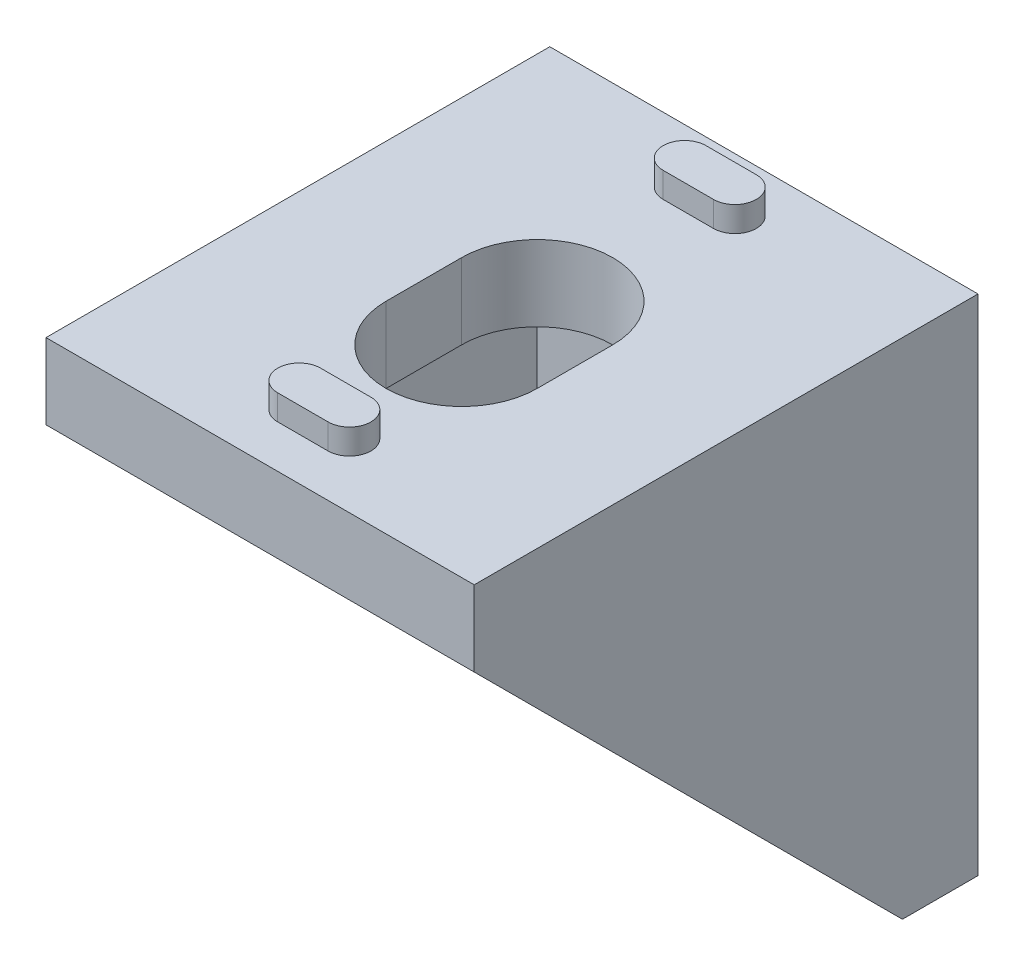
ISO-10303-21;
HEADER;
FILE_DESCRIPTION(('STEP AP214'),'2;1');
FILE_NAME('part.step','',(''),(''),'','','');
FILE_SCHEMA(('AUTOMOTIVE_DESIGN { 1 0 10303 214 1 1 1 1 }'));
ENDSEC;
DATA;
#1=APPLICATION_CONTEXT('core data for automotive mechanical design processes');
#2=APPLICATION_PROTOCOL_DEFINITION('international standard','automotive_design',2000,#1);
#3=PRODUCT_CONTEXT('',#1,'mechanical');
#4=PRODUCT('Part','Part','',(#3));
#5=PRODUCT_RELATED_PRODUCT_CATEGORY('part','',(#4));
#6=PRODUCT_DEFINITION_FORMATION('','',#4);
#7=PRODUCT_DEFINITION_CONTEXT('part definition',#1,'design');
#8=PRODUCT_DEFINITION('design','',#6,#7);
#9=PRODUCT_DEFINITION_SHAPE('','',#8);
#10=(LENGTH_UNIT() NAMED_UNIT(*) SI_UNIT(.MILLI.,.METRE.));
#11=(NAMED_UNIT(*) PLANE_ANGLE_UNIT() SI_UNIT($,.RADIAN.));
#12=(NAMED_UNIT(*) SI_UNIT($,.STERADIAN.) SOLID_ANGLE_UNIT());
#13=UNCERTAINTY_MEASURE_WITH_UNIT(LENGTH_MEASURE(1.E-05),#10,'distance_accuracy_value','');
#14=(GEOMETRIC_REPRESENTATION_CONTEXT(3) GLOBAL_UNCERTAINTY_ASSIGNED_CONTEXT((#13)) GLOBAL_UNIT_ASSIGNED_CONTEXT((#10,
#11,#12)) REPRESENTATION_CONTEXT('',''));
#15=CARTESIAN_POINT('',(0.,0.,0.));
#16=DIRECTION('',(0.,0.,1.));
#17=DIRECTION('',(1.,0.,0.));
#18=AXIS2_PLACEMENT_3D('',#15,#16,#17);
#19=CARTESIAN_POINT('',(8.5,0.,0.));
#20=DIRECTION('',(0.,-1.,0.));
#21=DIRECTION('',(0.,0.,-1.));
#22=AXIS2_PLACEMENT_3D('',#19,#20,#21);
#23=PLANE('',#22);
#24=DIRECTION('',(1.,0.,0.));
#25=VECTOR('',#24,1.);
#26=CARTESIAN_POINT('',(0.999999999999997,0.,16.6));
#27=LINE('',#26,#25);
#28=CARTESIAN_POINT('',(-1.,0.,16.6));
#29=VERTEX_POINT('',#28);
#30=CARTESIAN_POINT('',(0.999999999999997,0.,16.6));
#31=VERTEX_POINT('',#30);
#32=EDGE_CURVE('E273',#29,#31,#27,.T.);
#33=ORIENTED_EDGE('',*,*,#32,.T.);
#34=CARTESIAN_POINT('',(0.999999999999995,0.,17.45));
#35=DIRECTION('',(0.,-1.,0.));
#36=DIRECTION('',(0.,0.,-1.));
#37=AXIS2_PLACEMENT_3D('',#34,#35,#36);
#38=CIRCLE('',#37,0.85);
#39=CARTESIAN_POINT('',(0.999999999999997,0.,18.3));
#40=VERTEX_POINT('',#39);
#41=EDGE_CURVE('E247',#31,#40,#38,.T.);
#42=ORIENTED_EDGE('',*,*,#41,.T.);
#43=DIRECTION('',(-1.,0.,0.));
#44=VECTOR('',#43,1.);
#45=CARTESIAN_POINT('',(0.999999999999997,0.,18.3));
#46=LINE('',#45,#44);
#47=CARTESIAN_POINT('',(-0.999999999999999,0.,18.3));
#48=VERTEX_POINT('',#47);
#49=EDGE_CURVE('E263',#40,#48,#46,.T.);
#50=ORIENTED_EDGE('',*,*,#49,.T.);
#51=CARTESIAN_POINT('',(-1.,0.,17.45));
#52=DIRECTION('',(0.,-1.,0.));
#53=DIRECTION('',(0.,0.,1.));
#54=AXIS2_PLACEMENT_3D('',#51,#52,#53);
#55=CIRCLE('',#54,0.85);
#56=EDGE_CURVE('E47',#48,#29,#55,.T.);
#57=ORIENTED_EDGE('',*,*,#56,.T.);
#58=EDGE_LOOP('',(#33,#42,#50,#57));
#59=FACE_BOUND('',#58,.T.);
#60=DIRECTION('',(1.,0.,0.));
#61=VECTOR('',#60,1.);
#62=CARTESIAN_POINT('',(1.,0.,1.3));
#63=LINE('',#62,#61);
#64=CARTESIAN_POINT('',(-1.,0.,1.3));
#65=VERTEX_POINT('',#64);
#66=CARTESIAN_POINT('',(1.,0.,1.3));
#67=VERTEX_POINT('',#66);
#68=EDGE_CURVE('E298',#65,#67,#63,.T.);
#69=ORIENTED_EDGE('',*,*,#68,.T.);
#70=CARTESIAN_POINT('',(1.,0.,2.15));
#71=DIRECTION('',(0.,-1.,0.));
#72=DIRECTION('',(0.,0.,1.));
#73=AXIS2_PLACEMENT_3D('',#70,#71,#72);
#74=CIRCLE('',#73,0.85);
#75=CARTESIAN_POINT('',(1.,0.,3.));
#76=VERTEX_POINT('',#75);
#77=EDGE_CURVE('E252',#67,#76,#74,.T.);
#78=ORIENTED_EDGE('',*,*,#77,.T.);
#79=DIRECTION('',(-1.,0.,0.));
#80=VECTOR('',#79,1.);
#81=CARTESIAN_POINT('',(1.,0.,3.));
#82=LINE('',#81,#80);
#83=CARTESIAN_POINT('',(-0.999999999999999,0.,3.));
#84=VERTEX_POINT('',#83);
#85=EDGE_CURVE('E286',#76,#84,#82,.T.);
#86=ORIENTED_EDGE('',*,*,#85,.T.);
#87=CARTESIAN_POINT('',(-1.,0.,2.15));
#88=DIRECTION('',(0.,-1.,0.));
#89=DIRECTION('',(0.,0.,-1.));
#90=AXIS2_PLACEMENT_3D('',#87,#88,#89);
#91=CIRCLE('',#90,0.85);
#92=EDGE_CURVE('E55',#84,#65,#91,.T.);
#93=ORIENTED_EDGE('',*,*,#92,.T.);
#94=EDGE_LOOP('',(#69,#78,#86,#93));
#95=FACE_BOUND('',#94,.T.);
#96=DIRECTION('',(0.,0.,1.));
#97=VECTOR('',#96,1.);
#98=CARTESIAN_POINT('',(-8.5,0.,0.));
#99=LINE('',#98,#97);
#100=CARTESIAN_POINT('',(-8.5,0.,0.));
#101=VERTEX_POINT('',#100);
#102=CARTESIAN_POINT('',(-8.5,0.,20.));
#103=VERTEX_POINT('',#102);
#104=EDGE_CURVE('E476',#101,#103,#99,.T.);
#105=ORIENTED_EDGE('',*,*,#104,.T.);
#106=DIRECTION('',(-1.,0.,0.));
#107=VECTOR('',#106,1.);
#108=CARTESIAN_POINT('',(8.5,0.,20.));
#109=LINE('',#108,#107);
#110=CARTESIAN_POINT('',(8.5,0.,20.));
#111=VERTEX_POINT('',#110);
#112=EDGE_CURVE('E495',#111,#103,#109,.T.);
#113=ORIENTED_EDGE('',*,*,#112,.F.);
#114=DIRECTION('',(0.,0.,1.));
#115=VECTOR('',#114,1.);
#116=CARTESIAN_POINT('',(8.5,0.,0.));
#117=LINE('',#116,#115);
#118=CARTESIAN_POINT('',(8.5,0.,0.));
#119=VERTEX_POINT('',#118);
#120=EDGE_CURVE('E464',#119,#111,#117,.T.);
#121=ORIENTED_EDGE('',*,*,#120,.F.);
#122=DIRECTION('',(-1.,0.,0.));
#123=VECTOR('',#122,1.);
#124=CARTESIAN_POINT('',(8.5,0.,0.));
#125=LINE('',#124,#123);
#126=EDGE_CURVE('E498',#119,#101,#125,.T.);
#127=ORIENTED_EDGE('',*,*,#126,.T.);
#128=EDGE_LOOP('',(#105,#113,#121,#127));
#129=FACE_BOUND('',#128,.T.);
#130=CARTESIAN_POINT('',(0.,0.,9.00000000000001));
#131=DIRECTION('',(0.,-1.,0.));
#132=DIRECTION('',(0.,0.,-1.));
#133=AXIS2_PLACEMENT_3D('',#130,#131,#132);
#134=CIRCLE('',#133,3.);
#135=CARTESIAN_POINT('',(-3.,0.,9.));
#136=VERTEX_POINT('',#135);
#137=CARTESIAN_POINT('',(3.,0.,9.));
#138=VERTEX_POINT('',#137);
#139=EDGE_CURVE('E317',#136,#138,#134,.T.);
#140=ORIENTED_EDGE('',*,*,#139,.T.);
#141=DIRECTION('',(0.,0.,1.));
#142=VECTOR('',#141,1.);
#143=CARTESIAN_POINT('',(3.,0.,9.00000000000001));
#144=LINE('',#143,#142);
#145=CARTESIAN_POINT('',(3.,0.,12.));
#146=VERTEX_POINT('',#145);
#147=EDGE_CURVE('E335',#138,#146,#144,.T.);
#148=ORIENTED_EDGE('',*,*,#147,.T.);
#149=CARTESIAN_POINT('',(0.,0.,12.));
#150=DIRECTION('',(0.,-1.,0.));
#151=DIRECTION('',(0.,0.,-1.));
#152=AXIS2_PLACEMENT_3D('',#149,#150,#151);
#153=CIRCLE('',#152,3.);
#154=CARTESIAN_POINT('',(-3.,0.,12.));
#155=VERTEX_POINT('',#154);
#156=EDGE_CURVE('E311',#146,#155,#153,.T.);
#157=ORIENTED_EDGE('',*,*,#156,.T.);
#158=DIRECTION('',(0.,0.,-1.));
#159=VECTOR('',#158,1.);
#160=CARTESIAN_POINT('',(-3.,0.,9.00000000000001));
#161=LINE('',#160,#159);
#162=EDGE_CURVE('E314',#155,#136,#161,.T.);
#163=ORIENTED_EDGE('',*,*,#162,.T.);
#164=EDGE_LOOP('',(#140,#148,#157,#163));
#165=FACE_BOUND('',#164,.T.);
#166=ADVANCED_FACE('F32',(#59,#95,#129,#165),#23,.F.);
#167=CARTESIAN_POINT('',(-6.,-3.,2.99999999999999));
#168=DIRECTION('',(0.,1.,0.));
#169=DIRECTION('',(0.,0.,1.));
#170=AXIS2_PLACEMENT_3D('',#167,#168,#169);
#171=PLANE('',#170);
#172=DIRECTION('',(0.,0.,1.));
#173=VECTOR('',#172,1.);
#174=CARTESIAN_POINT('',(6.,-3.,2.99999999999999));
#175=LINE('',#174,#173);
#176=CARTESIAN_POINT('',(6.,-3.,2.99999999999999));
#177=VERTEX_POINT('',#176);
#178=CARTESIAN_POINT('',(6.,-3.,20.));
#179=VERTEX_POINT('',#178);
#180=EDGE_CURVE('E446',#177,#179,#175,.T.);
#181=ORIENTED_EDGE('',*,*,#180,.T.);
#182=DIRECTION('',(1.,0.,0.));
#183=VECTOR('',#182,1.);
#184=CARTESIAN_POINT('',(-6.,-3.,20.));
#185=LINE('',#184,#183);
#186=CARTESIAN_POINT('',(-6.,-3.,20.));
#187=VERTEX_POINT('',#186);
#188=EDGE_CURVE('E457',#187,#179,#185,.T.);
#189=ORIENTED_EDGE('',*,*,#188,.F.);
#190=DIRECTION('',(0.,0.,1.));
#191=VECTOR('',#190,1.);
#192=CARTESIAN_POINT('',(-6.,-3.,2.99999999999999));
#193=LINE('',#192,#191);
#194=CARTESIAN_POINT('',(-6.,-3.,2.99999999999999));
#195=VERTEX_POINT('',#194);
#196=EDGE_CURVE('E445',#195,#187,#193,.T.);
#197=ORIENTED_EDGE('',*,*,#196,.F.);
#198=DIRECTION('',(1.,0.,0.));
#199=VECTOR('',#198,1.);
#200=CARTESIAN_POINT('',(-6.,-3.,2.99999999999999));
#201=LINE('',#200,#199);
#202=EDGE_CURVE('E449',#195,#177,#201,.T.);
#203=ORIENTED_EDGE('',*,*,#202,.T.);
#204=EDGE_LOOP('',(#181,#189,#197,#203));
#205=FACE_BOUND('',#204,.T.);
#206=CARTESIAN_POINT('',(0.,-3.,9.));
#207=DIRECTION('',(0.,1.,0.));
#208=DIRECTION('',(-1.,0.,0.));
#209=AXIS2_PLACEMENT_3D('',#206,#207,#208);
#210=CIRCLE('',#209,3.);
#211=CARTESIAN_POINT('',(3.,-3.,9.));
#212=VERTEX_POINT('',#211);
#213=CARTESIAN_POINT('',(-3.,-3.,9.));
#214=VERTEX_POINT('',#213);
#215=EDGE_CURVE('E320',#212,#214,#210,.T.);
#216=ORIENTED_EDGE('',*,*,#215,.T.);
#217=DIRECTION('',(0.,0.,1.));
#218=VECTOR('',#217,1.);
#219=CARTESIAN_POINT('',(-3.,-3.,9.));
#220=LINE('',#219,#218);
#221=CARTESIAN_POINT('',(-3.,-3.,12.));
#222=VERTEX_POINT('',#221);
#223=EDGE_CURVE('E329',#214,#222,#220,.T.);
#224=ORIENTED_EDGE('',*,*,#223,.T.);
#225=CARTESIAN_POINT('',(0.,-3.,12.));
#226=DIRECTION('',(0.,1.,0.));
#227=DIRECTION('',(1.,0.,0.));
#228=AXIS2_PLACEMENT_3D('',#225,#226,#227);
#229=CIRCLE('',#228,3.);
#230=CARTESIAN_POINT('',(3.,-3.,12.));
#231=VERTEX_POINT('',#230);
#232=EDGE_CURVE('E326',#222,#231,#229,.T.);
#233=ORIENTED_EDGE('',*,*,#232,.T.);
#234=DIRECTION('',(0.,0.,-1.));
#235=VECTOR('',#234,1.);
#236=CARTESIAN_POINT('',(3.,-3.,9.));
#237=LINE('',#236,#235);
#238=EDGE_CURVE('E323',#231,#212,#237,.T.);
#239=ORIENTED_EDGE('',*,*,#238,.T.);
#240=EDGE_LOOP('',(#216,#224,#233,#239));
#241=FACE_BOUND('',#240,.T.);
#242=ADVANCED_FACE('F508',(#205,#241),#171,.F.);
#243=CARTESIAN_POINT('',(8.5,0.,0.));
#244=DIRECTION('',(0.,0.,1.));
#245=DIRECTION('',(0.,-1.,0.));
#246=AXIS2_PLACEMENT_3D('',#243,#244,#245);
#247=PLANE('',#246);
#248=CARTESIAN_POINT('',(1.,-2.15,0.));
#249=DIRECTION('',(0.,0.,-1.));
#250=DIRECTION('',(0.,-1.,0.));
#251=AXIS2_PLACEMENT_3D('',#248,#249,#250);
#252=CIRCLE('',#251,0.85);
#253=CARTESIAN_POINT('',(1.,-1.3,0.));
#254=VERTEX_POINT('',#253);
#255=CARTESIAN_POINT('',(1.,-3.,0.));
#256=VERTEX_POINT('',#255);
#257=EDGE_CURVE('E377',#254,#256,#252,.T.);
#258=ORIENTED_EDGE('',*,*,#257,.F.);
#259=DIRECTION('',(1.,0.,0.));
#260=VECTOR('',#259,1.);
#261=CARTESIAN_POINT('',(1.,-1.3,0.));
#262=LINE('',#261,#260);
#263=CARTESIAN_POINT('',(-0.999999999999999,-1.3,0.));
#264=VERTEX_POINT('',#263);
#265=EDGE_CURVE('E382',#264,#254,#262,.T.);
#266=ORIENTED_EDGE('',*,*,#265,.F.);
#267=CARTESIAN_POINT('',(-1.,-2.15,0.));
#268=DIRECTION('',(0.,0.,-1.));
#269=DIRECTION('',(0.,1.,0.));
#270=AXIS2_PLACEMENT_3D('',#267,#268,#269);
#271=CIRCLE('',#270,0.85);
#272=CARTESIAN_POINT('',(-1.,-3.,0.));
#273=VERTEX_POINT('',#272);
#274=EDGE_CURVE('E394',#273,#264,#271,.T.);
#275=ORIENTED_EDGE('',*,*,#274,.F.);
#276=DIRECTION('',(-1.,0.,0.));
#277=VECTOR('',#276,1.);
#278=CARTESIAN_POINT('',(1.,-3.,0.));
#279=LINE('',#278,#277);
#280=EDGE_CURVE('E391',#256,#273,#279,.T.);
#281=ORIENTED_EDGE('',*,*,#280,.F.);
#282=EDGE_LOOP('',(#258,#266,#275,#281));
#283=FACE_BOUND('',#282,.T.);
#284=DIRECTION('',(0.,-1.,0.));
#285=VECTOR('',#284,1.);
#286=CARTESIAN_POINT('',(3.,-9.00000000000001,0.));
#287=LINE('',#286,#285);
#288=CARTESIAN_POINT('',(3.,-9.00000000000001,0.));
#289=VERTEX_POINT('',#288);
#290=CARTESIAN_POINT('',(3.,-12.,0.));
#291=VERTEX_POINT('',#290);
#292=EDGE_CURVE('E412',#289,#291,#287,.T.);
#293=ORIENTED_EDGE('',*,*,#292,.F.);
#294=CARTESIAN_POINT('',(0.,-9.00000000000001,0.));
#295=DIRECTION('',(0.,0.,1.));
#296=DIRECTION('',(0.,-1.,0.));
#297=AXIS2_PLACEMENT_3D('',#294,#295,#296);
#298=CIRCLE('',#297,3.);
#299=CARTESIAN_POINT('',(-3.,-9.00000000000001,0.));
#300=VERTEX_POINT('',#299);
#301=EDGE_CURVE('E415',#300,#289,#298,.F.);
#302=ORIENTED_EDGE('',*,*,#301,.F.);
#303=DIRECTION('',(0.,1.,0.));
#304=VECTOR('',#303,1.);
#305=CARTESIAN_POINT('',(-3.,-9.00000000000001,0.));
#306=LINE('',#305,#304);
#307=CARTESIAN_POINT('',(-3.,-12.,0.));
#308=VERTEX_POINT('',#307);
#309=EDGE_CURVE('E432',#308,#300,#306,.T.);
#310=ORIENTED_EDGE('',*,*,#309,.F.);
#311=CARTESIAN_POINT('',(0.,-12.,0.));
#312=DIRECTION('',(0.,0.,1.));
#313=DIRECTION('',(0.,-1.,0.));
#314=AXIS2_PLACEMENT_3D('',#311,#312,#313);
#315=CIRCLE('',#314,3.);
#316=EDGE_CURVE('E410',#291,#308,#315,.F.);
#317=ORIENTED_EDGE('',*,*,#316,.F.);
#318=EDGE_LOOP('',(#293,#302,#310,#317));
#319=FACE_BOUND('',#318,.T.);
#320=DIRECTION('',(0.,1.,0.));
#321=VECTOR('',#320,1.);
#322=CARTESIAN_POINT('',(-8.5,0.,0.));
#323=LINE('',#322,#321);
#324=CARTESIAN_POINT('',(-8.5,-20.,0.));
#325=VERTEX_POINT('',#324);
#326=EDGE_CURVE('E456',#325,#101,#323,.T.);
#327=ORIENTED_EDGE('',*,*,#326,.T.);
#328=ORIENTED_EDGE('',*,*,#126,.F.);
#329=DIRECTION('',(0.,1.,0.));
#330=VECTOR('',#329,1.);
#331=CARTESIAN_POINT('',(8.5,0.,0.));
#332=LINE('',#331,#330);
#333=CARTESIAN_POINT('',(8.5,-20.,0.));
#334=VERTEX_POINT('',#333);
#335=EDGE_CURVE('E461',#334,#119,#332,.T.);
#336=ORIENTED_EDGE('',*,*,#335,.F.);
#337=DIRECTION('',(-1.,0.,0.));
#338=VECTOR('',#337,1.);
#339=CARTESIAN_POINT('',(8.5,-20.,0.));
#340=LINE('',#339,#338);
#341=EDGE_CURVE('E473',#334,#325,#340,.T.);
#342=ORIENTED_EDGE('',*,*,#341,.T.);
#343=EDGE_LOOP('',(#327,#328,#336,#342));
#344=FACE_BOUND('',#343,.T.);
#345=CARTESIAN_POINT('',(0.999999999999995,-17.45,0.));
#346=DIRECTION('',(0.,0.,-1.));
#347=DIRECTION('',(0.,1.,0.));
#348=AXIS2_PLACEMENT_3D('',#345,#346,#347);
#349=CIRCLE('',#348,0.85);
#350=CARTESIAN_POINT('',(0.999999999999997,-16.6,0.));
#351=VERTEX_POINT('',#350);
#352=CARTESIAN_POINT('',(0.999999999999997,-18.3,0.));
#353=VERTEX_POINT('',#352);
#354=EDGE_CURVE('E344',#351,#353,#349,.T.);
#355=ORIENTED_EDGE('',*,*,#354,.F.);
#356=DIRECTION('',(1.,0.,0.));
#357=VECTOR('',#356,1.);
#358=CARTESIAN_POINT('',(0.999999999999997,-16.6,0.));
#359=LINE('',#358,#357);
#360=CARTESIAN_POINT('',(-1.,-16.6,0.));
#361=VERTEX_POINT('',#360);
#362=EDGE_CURVE('E349',#361,#351,#359,.T.);
#363=ORIENTED_EDGE('',*,*,#362,.F.);
#364=CARTESIAN_POINT('',(-1.,-17.45,0.));
#365=DIRECTION('',(0.,0.,-1.));
#366=DIRECTION('',(0.,-1.,0.));
#367=AXIS2_PLACEMENT_3D('',#364,#365,#366);
#368=CIRCLE('',#367,0.85);
#369=CARTESIAN_POINT('',(-1.,-18.3,0.));
#370=VERTEX_POINT('',#369);
#371=EDGE_CURVE('E361',#370,#361,#368,.T.);
#372=ORIENTED_EDGE('',*,*,#371,.F.);
#373=DIRECTION('',(-1.,0.,0.));
#374=VECTOR('',#373,1.);
#375=CARTESIAN_POINT('',(0.999999999999997,-18.3,0.));
#376=LINE('',#375,#374);
#377=EDGE_CURVE('E358',#353,#370,#376,.T.);
#378=ORIENTED_EDGE('',*,*,#377,.F.);
#379=EDGE_LOOP('',(#355,#363,#372,#378));
#380=FACE_BOUND('',#379,.T.);
#381=ADVANCED_FACE('F34',(#283,#319,#344,#380),#247,.F.);
#382=CARTESIAN_POINT('',(8.5,-20.,2.99999999999999));
#383=DIRECTION('',(0.,0.707106781186548,-0.707106781186547));
#384=DIRECTION('',(0.,0.707106781186547,0.707106781186548));
#385=AXIS2_PLACEMENT_3D('',#382,#383,#384);
#386=PLANE('',#385);
#387=DIRECTION('',(0.,0.707106781186547,0.707106781186548));
#388=VECTOR('',#387,1.);
#389=CARTESIAN_POINT('',(6.,-20.,2.99999999999999));
#390=LINE('',#389,#388);
#391=CARTESIAN_POINT('',(6.,-20.,2.99999999999999));
#392=VERTEX_POINT('',#391);
#393=EDGE_CURVE('E40',#392,#179,#390,.T.);
#394=ORIENTED_EDGE('',*,*,#393,.F.);
#395=DIRECTION('',(-1.,0.,0.));
#396=VECTOR('',#395,1.);
#397=CARTESIAN_POINT('',(8.5,-20.,2.99999999999999));
#398=LINE('',#397,#396);
#399=CARTESIAN_POINT('',(8.5,-20.,2.99999999999999));
#400=VERTEX_POINT('',#399);
#401=EDGE_CURVE('E488',#400,#392,#398,.T.);
#402=ORIENTED_EDGE('',*,*,#401,.F.);
#403=DIRECTION('',(0.,-0.707106781186548,-0.707106781186548));
#404=VECTOR('',#403,1.);
#405=CARTESIAN_POINT('',(8.5,-3.,20.));
#406=LINE('',#405,#404);
#407=CARTESIAN_POINT('',(8.5,-3.,20.));
#408=VERTEX_POINT('',#407);
#409=EDGE_CURVE('E469',#408,#400,#406,.T.);
#410=ORIENTED_EDGE('',*,*,#409,.F.);
#411=DIRECTION('',(-1.,0.,0.));
#412=VECTOR('',#411,1.);
#413=CARTESIAN_POINT('',(8.5,-3.,20.));
#414=LINE('',#413,#412);
#415=EDGE_CURVE('E492',#408,#179,#414,.T.);
#416=ORIENTED_EDGE('',*,*,#415,.T.);
#417=EDGE_LOOP('',(#394,#402,#410,#416));
#418=FACE_BOUND('',#417,.T.);
#419=ADVANCED_FACE('F517',(#418),#386,.F.);
#420=CARTESIAN_POINT('',(8.5,0.,20.));
#421=DIRECTION('',(0.,0.,-1.));
#422=DIRECTION('',(-1.,0.,0.));
#423=AXIS2_PLACEMENT_3D('',#420,#421,#422);
#424=PLANE('',#423);
#425=DIRECTION('',(0.,-1.,0.));
#426=VECTOR('',#425,1.);
#427=CARTESIAN_POINT('',(-8.5,0.,20.));
#428=LINE('',#427,#426);
#429=CARTESIAN_POINT('',(-8.5,-3.,20.));
#430=VERTEX_POINT('',#429);
#431=EDGE_CURVE('E478',#103,#430,#428,.T.);
#432=ORIENTED_EDGE('',*,*,#431,.T.);
#433=EDGE_CURVE('E491',#187,#430,#414,.T.);
#434=ORIENTED_EDGE('',*,*,#433,.F.);
#435=ORIENTED_EDGE('',*,*,#188,.T.);
#436=ORIENTED_EDGE('',*,*,#415,.F.);
#437=DIRECTION('',(0.,-1.,0.));
#438=VECTOR('',#437,1.);
#439=CARTESIAN_POINT('',(8.5,0.,20.));
#440=LINE('',#439,#438);
#441=EDGE_CURVE('E467',#111,#408,#440,.T.);
#442=ORIENTED_EDGE('',*,*,#441,.F.);
#443=ORIENTED_EDGE('',*,*,#112,.T.);
#444=EDGE_LOOP('',(#432,#434,#435,#436,#442,#443));
#445=FACE_BOUND('',#444,.T.);
#446=ADVANCED_FACE('F514',(#445),#424,.F.);
#447=CARTESIAN_POINT('',(-6.,-20.,2.99999999999999));
#448=VERTEX_POINT('',#447);
#449=CARTESIAN_POINT('',(-8.5,-20.,2.99999999999999));
#450=VERTEX_POINT('',#449);
#451=EDGE_CURVE('E487',#448,#450,#398,.T.);
#452=ORIENTED_EDGE('',*,*,#451,.F.);
#453=DIRECTION('',(0.,0.707106781186547,0.707106781186548));
#454=VECTOR('',#453,1.);
#455=CARTESIAN_POINT('',(-6.,-20.,2.99999999999999));
#456=LINE('',#455,#454);
#457=EDGE_CURVE('E11',#448,#187,#456,.T.);
#458=ORIENTED_EDGE('',*,*,#457,.T.);
#459=ORIENTED_EDGE('',*,*,#433,.T.);
#460=DIRECTION('',(0.,-0.707106781186547,-0.707106781186548));
#461=VECTOR('',#460,1.);
#462=CARTESIAN_POINT('',(-8.5,-20.,2.99999999999999));
#463=LINE('',#462,#461);
#464=EDGE_CURVE('E481',#430,#450,#463,.T.);
#465=ORIENTED_EDGE('',*,*,#464,.T.);
#466=EDGE_LOOP('',(#452,#458,#459,#465));
#467=FACE_BOUND('',#466,.T.);
#468=ADVANCED_FACE('F532',(#467),#386,.F.);
#469=CARTESIAN_POINT('',(8.5,-20.,0.));
#470=DIRECTION('',(0.,1.,0.));
#471=DIRECTION('',(0.,0.,1.));
#472=AXIS2_PLACEMENT_3D('',#469,#470,#471);
#473=PLANE('',#472);
#474=DIRECTION('',(0.,0.,-1.));
#475=VECTOR('',#474,1.);
#476=CARTESIAN_POINT('',(-8.5,-20.,0.));
#477=LINE('',#476,#475);
#478=EDGE_CURVE('E465',#450,#325,#477,.T.);
#479=ORIENTED_EDGE('',*,*,#478,.T.);
#480=ORIENTED_EDGE('',*,*,#341,.F.);
#481=DIRECTION('',(0.,0.,-1.));
#482=VECTOR('',#481,1.);
#483=CARTESIAN_POINT('',(8.5,-20.,0.));
#484=LINE('',#483,#482);
#485=EDGE_CURVE('E471',#400,#334,#484,.T.);
#486=ORIENTED_EDGE('',*,*,#485,.F.);
#487=ORIENTED_EDGE('',*,*,#401,.T.);
#488=DIRECTION('',(1.,0.,0.));
#489=VECTOR('',#488,1.);
#490=CARTESIAN_POINT('',(-6.,-20.,2.99999999999999));
#491=LINE('',#490,#489);
#492=EDGE_CURVE('E454',#448,#392,#491,.T.);
#493=ORIENTED_EDGE('',*,*,#492,.F.);
#494=ORIENTED_EDGE('',*,*,#451,.T.);
#495=EDGE_LOOP('',(#479,#480,#486,#487,#493,#494));
#496=FACE_BOUND('',#495,.T.);
#497=ADVANCED_FACE('F540',(#496),#473,.F.);
#498=CARTESIAN_POINT('',(8.5,0.,0.));
#499=DIRECTION('',(-1.,0.,0.));
#500=DIRECTION('',(0.,0.,1.));
#501=AXIS2_PLACEMENT_3D('',#498,#499,#500);
#502=PLANE('',#501);
#503=ORIENTED_EDGE('',*,*,#335,.T.);
#504=ORIENTED_EDGE('',*,*,#120,.T.);
#505=ORIENTED_EDGE('',*,*,#441,.T.);
#506=ORIENTED_EDGE('',*,*,#409,.T.);
#507=ORIENTED_EDGE('',*,*,#485,.T.);
#508=EDGE_LOOP('',(#503,#504,#505,#506,#507));
#509=FACE_BOUND('',#508,.T.);
#510=ADVANCED_FACE('F520',(#509),#502,.F.);
#511=CARTESIAN_POINT('',(-8.5,0.,0.));
#512=DIRECTION('',(-1.,0.,0.));
#513=DIRECTION('',(0.,0.,1.));
#514=AXIS2_PLACEMENT_3D('',#511,#512,#513);
#515=PLANE('',#514);
#516=ORIENTED_EDGE('',*,*,#326,.F.);
#517=ORIENTED_EDGE('',*,*,#478,.F.);
#518=ORIENTED_EDGE('',*,*,#464,.F.);
#519=ORIENTED_EDGE('',*,*,#431,.F.);
#520=ORIENTED_EDGE('',*,*,#104,.F.);
#521=EDGE_LOOP('',(#516,#517,#518,#519,#520));
#522=FACE_BOUND('',#521,.T.);
#523=ADVANCED_FACE('F528',(#522),#515,.T.);
#524=CARTESIAN_POINT('',(-6.,0.,0.));
#525=DIRECTION('',(-1.,0.,0.));
#526=DIRECTION('',(0.,0.,1.));
#527=AXIS2_PLACEMENT_3D('',#524,#525,#526);
#528=PLANE('',#527);
#529=DIRECTION('',(0.,1.,0.));
#530=VECTOR('',#529,1.);
#531=CARTESIAN_POINT('',(-6.,-3.,2.99999999999999));
#532=LINE('',#531,#530);
#533=EDGE_CURVE('E442',#448,#195,#532,.T.);
#534=ORIENTED_EDGE('',*,*,#533,.T.);
#535=ORIENTED_EDGE('',*,*,#196,.T.);
#536=ORIENTED_EDGE('',*,*,#457,.F.);
#537=EDGE_LOOP('',(#534,#535,#536));
#538=FACE_BOUND('',#537,.T.);
#539=ADVANCED_FACE('F536',(#538),#528,.F.);
#540=CARTESIAN_POINT('',(6.,0.,0.));
#541=DIRECTION('',(-1.,0.,0.));
#542=DIRECTION('',(0.,0.,1.));
#543=AXIS2_PLACEMENT_3D('',#540,#541,#542);
#544=PLANE('',#543);
#545=ORIENTED_EDGE('',*,*,#393,.T.);
#546=ORIENTED_EDGE('',*,*,#180,.F.);
#547=DIRECTION('',(0.,1.,0.));
#548=VECTOR('',#547,1.);
#549=CARTESIAN_POINT('',(6.,-3.,2.99999999999999));
#550=LINE('',#549,#548);
#551=EDGE_CURVE('E441',#392,#177,#550,.T.);
#552=ORIENTED_EDGE('',*,*,#551,.F.);
#553=EDGE_LOOP('',(#545,#546,#552));
#554=FACE_BOUND('',#553,.T.);
#555=ADVANCED_FACE('F504',(#554),#544,.T.);
#556=CARTESIAN_POINT('',(-6.,-3.,2.99999999999999));
#557=DIRECTION('',(0.,0.,-1.));
#558=DIRECTION('',(0.,1.,0.));
#559=AXIS2_PLACEMENT_3D('',#556,#557,#558);
#560=PLANE('',#559);
#561=DIRECTION('',(0.,-1.,0.));
#562=VECTOR('',#561,1.);
#563=CARTESIAN_POINT('',(-3.,-9.00000000000001,2.99999999999999));
#564=LINE('',#563,#562);
#565=CARTESIAN_POINT('',(-3.,-9.00000000000001,2.99999999999999));
#566=VERTEX_POINT('',#565);
#567=CARTESIAN_POINT('',(-3.,-12.,2.99999999999999));
#568=VERTEX_POINT('',#567);
#569=EDGE_CURVE('E420',#566,#568,#564,.T.);
#570=ORIENTED_EDGE('',*,*,#569,.F.);
#571=CARTESIAN_POINT('',(0.,-9.00000000000001,2.99999999999999));
#572=DIRECTION('',(0.,0.,1.));
#573=DIRECTION('',(-1.,0.,0.));
#574=AXIS2_PLACEMENT_3D('',#571,#572,#573);
#575=CIRCLE('',#574,3.);
#576=CARTESIAN_POINT('',(3.,-9.00000000000001,2.99999999999999));
#577=VERTEX_POINT('',#576);
#578=EDGE_CURVE('E418',#577,#566,#575,.T.);
#579=ORIENTED_EDGE('',*,*,#578,.F.);
#580=DIRECTION('',(0.,1.,0.));
#581=VECTOR('',#580,1.);
#582=CARTESIAN_POINT('',(3.,-9.00000000000001,2.99999999999999));
#583=LINE('',#582,#581);
#584=CARTESIAN_POINT('',(3.,-12.,2.99999999999999));
#585=VERTEX_POINT('',#584);
#586=EDGE_CURVE('E426',#585,#577,#583,.T.);
#587=ORIENTED_EDGE('',*,*,#586,.F.);
#588=CARTESIAN_POINT('',(0.,-12.,2.99999999999999));
#589=DIRECTION('',(0.,0.,1.));
#590=DIRECTION('',(1.,0.,0.));
#591=AXIS2_PLACEMENT_3D('',#588,#589,#590);
#592=CIRCLE('',#591,3.);
#593=EDGE_CURVE('E423',#568,#585,#592,.T.);
#594=ORIENTED_EDGE('',*,*,#593,.F.);
#595=EDGE_LOOP('',(#570,#579,#587,#594));
#596=FACE_BOUND('',#595,.T.);
#597=ORIENTED_EDGE('',*,*,#551,.T.);
#598=ORIENTED_EDGE('',*,*,#202,.F.);
#599=ORIENTED_EDGE('',*,*,#533,.F.);
#600=ORIENTED_EDGE('',*,*,#492,.T.);
#601=EDGE_LOOP('',(#597,#598,#599,#600));
#602=FACE_BOUND('',#601,.T.);
#603=ADVANCED_FACE('F538',(#596,#602),#560,.F.);
#604=CARTESIAN_POINT('',(0.,-9.00000000000001,-0.00100000000001401));
#605=DIRECTION('',(0.,0.,1.));
#606=DIRECTION('',(1.,0.,0.));
#607=AXIS2_PLACEMENT_3D('',#604,#605,#606);
#608=CYLINDRICAL_SURFACE('',#607,3.);
#609=ORIENTED_EDGE('',*,*,#301,.T.);
#610=DIRECTION('',(0.,0.,1.));
#611=VECTOR('',#610,1.);
#612=CARTESIAN_POINT('',(3.,-9.00000000000001,-0.00100000000001401));
#613=LINE('',#612,#611);
#614=EDGE_CURVE('E430',#289,#577,#613,.T.);
#615=ORIENTED_EDGE('',*,*,#614,.T.);
#616=ORIENTED_EDGE('',*,*,#578,.T.);
#617=DIRECTION('',(0.,0.,1.));
#618=VECTOR('',#617,1.);
#619=CARTESIAN_POINT('',(-3.,-9.00000000000001,-0.00100000000001401));
#620=LINE('',#619,#618);
#621=EDGE_CURVE('E429',#300,#566,#620,.T.);
#622=ORIENTED_EDGE('',*,*,#621,.F.);
#623=EDGE_LOOP('',(#609,#615,#616,#622));
#624=FACE_BOUND('',#623,.T.);
#625=ADVANCED_FACE('F621',(#624),#608,.F.);
#626=CARTESIAN_POINT('',(3.,-9.00000000000001,-0.00100000000001401));
#627=DIRECTION('',(1.,0.,0.));
#628=DIRECTION('',(0.,1.,0.));
#629=AXIS2_PLACEMENT_3D('',#626,#627,#628);
#630=PLANE('',#629);
#631=ORIENTED_EDGE('',*,*,#292,.T.);
#632=DIRECTION('',(0.,0.,1.));
#633=VECTOR('',#632,1.);
#634=CARTESIAN_POINT('',(3.,-12.,-0.00100000000001401));
#635=LINE('',#634,#633);
#636=EDGE_CURVE('E433',#291,#585,#635,.T.);
#637=ORIENTED_EDGE('',*,*,#636,.T.);
#638=ORIENTED_EDGE('',*,*,#586,.T.);
#639=ORIENTED_EDGE('',*,*,#614,.F.);
#640=EDGE_LOOP('',(#631,#637,#638,#639));
#641=FACE_BOUND('',#640,.T.);
#642=ADVANCED_FACE('F617',(#641),#630,.F.);
#643=CARTESIAN_POINT('',(0.,-12.,-0.00100000000001401));
#644=DIRECTION('',(0.,0.,1.));
#645=DIRECTION('',(1.,0.,0.));
#646=AXIS2_PLACEMENT_3D('',#643,#644,#645);
#647=CYLINDRICAL_SURFACE('',#646,3.);
#648=ORIENTED_EDGE('',*,*,#316,.T.);
#649=DIRECTION('',(0.,0.,1.));
#650=VECTOR('',#649,1.);
#651=CARTESIAN_POINT('',(-3.,-12.,-0.00100000000001401));
#652=LINE('',#651,#650);
#653=EDGE_CURVE('E435',#308,#568,#652,.T.);
#654=ORIENTED_EDGE('',*,*,#653,.T.);
#655=ORIENTED_EDGE('',*,*,#593,.T.);
#656=ORIENTED_EDGE('',*,*,#636,.F.);
#657=EDGE_LOOP('',(#648,#654,#655,#656));
#658=FACE_BOUND('',#657,.T.);
#659=ADVANCED_FACE('F620',(#658),#647,.F.);
#660=CARTESIAN_POINT('',(-3.,-9.00000000000001,-0.00100000000001401));
#661=DIRECTION('',(-1.,0.,0.));
#662=DIRECTION('',(0.,-1.,0.));
#663=AXIS2_PLACEMENT_3D('',#660,#661,#662);
#664=PLANE('',#663);
#665=ORIENTED_EDGE('',*,*,#309,.T.);
#666=ORIENTED_EDGE('',*,*,#621,.T.);
#667=ORIENTED_EDGE('',*,*,#569,.T.);
#668=ORIENTED_EDGE('',*,*,#653,.F.);
#669=EDGE_LOOP('',(#665,#666,#667,#668));
#670=FACE_BOUND('',#669,.T.);
#671=ADVANCED_FACE('F615',(#670),#664,.F.);
#672=CARTESIAN_POINT('',(1.,-2.15,-1.));
#673=DIRECTION('',(0.,0.,1.));
#674=DIRECTION('',(0.,-1.,0.));
#675=AXIS2_PLACEMENT_3D('',#672,#673,#674);
#676=CYLINDRICAL_SURFACE('',#675,0.85);
#677=ORIENTED_EDGE('',*,*,#257,.T.);
#678=DIRECTION('',(0.,0.,1.));
#679=VECTOR('',#678,1.);
#680=CARTESIAN_POINT('',(1.,-3.,-1.));
#681=LINE('',#680,#679);
#682=CARTESIAN_POINT('',(1.,-3.,-1.));
#683=VERTEX_POINT('',#682);
#684=EDGE_CURVE('E407',#683,#256,#681,.T.);
#685=ORIENTED_EDGE('',*,*,#684,.F.);
#686=CARTESIAN_POINT('',(1.,-2.15,-1.));
#687=DIRECTION('',(0.,0.,-1.));
#688=DIRECTION('',(0.,-1.,0.));
#689=AXIS2_PLACEMENT_3D('',#686,#687,#688);
#690=CIRCLE('',#689,0.85);
#691=CARTESIAN_POINT('',(1.,-1.3,-1.));
#692=VERTEX_POINT('',#691);
#693=EDGE_CURVE('E378',#692,#683,#690,.T.);
#694=ORIENTED_EDGE('',*,*,#693,.F.);
#695=DIRECTION('',(0.,0.,1.));
#696=VECTOR('',#695,1.);
#697=CARTESIAN_POINT('',(1.,-1.3,-1.));
#698=LINE('',#697,#696);
#699=EDGE_CURVE('E388',#692,#254,#698,.T.);
#700=ORIENTED_EDGE('',*,*,#699,.T.);
#701=EDGE_LOOP('',(#677,#685,#694,#700));
#702=FACE_BOUND('',#701,.T.);
#703=ADVANCED_FACE('F611',(#702),#676,.T.);
#704=CARTESIAN_POINT('',(1.,-3.,-1.));
#705=DIRECTION('',(0.,1.,0.));
#706=DIRECTION('',(0.,0.,1.));
#707=AXIS2_PLACEMENT_3D('',#704,#705,#706);
#708=PLANE('',#707);
#709=ORIENTED_EDGE('',*,*,#280,.T.);
#710=DIRECTION('',(0.,0.,1.));
#711=VECTOR('',#710,1.);
#712=CARTESIAN_POINT('',(-0.999999999999999,-3.,-1.));
#713=LINE('',#712,#711);
#714=CARTESIAN_POINT('',(-0.999999999999999,-3.,-1.));
#715=VERTEX_POINT('',#714);
#716=EDGE_CURVE('E404',#715,#273,#713,.T.);
#717=ORIENTED_EDGE('',*,*,#716,.F.);
#718=DIRECTION('',(-1.,0.,0.));
#719=VECTOR('',#718,1.);
#720=CARTESIAN_POINT('',(1.,-3.,-1.));
#721=LINE('',#720,#719);
#722=EDGE_CURVE('E381',#683,#715,#721,.T.);
#723=ORIENTED_EDGE('',*,*,#722,.F.);
#724=ORIENTED_EDGE('',*,*,#684,.T.);
#725=EDGE_LOOP('',(#709,#717,#723,#724));
#726=FACE_BOUND('',#725,.T.);
#727=ADVANCED_FACE('F607',(#726),#708,.F.);
#728=CARTESIAN_POINT('',(-1.,-2.15,-1.));
#729=DIRECTION('',(0.,0.,1.));
#730=DIRECTION('',(0.,-1.,0.));
#731=AXIS2_PLACEMENT_3D('',#728,#729,#730);
#732=CYLINDRICAL_SURFACE('',#731,0.85);
#733=ORIENTED_EDGE('',*,*,#274,.T.);
#734=DIRECTION('',(0.,0.,1.));
#735=VECTOR('',#734,1.);
#736=CARTESIAN_POINT('',(-1.,-1.3,-1.));
#737=LINE('',#736,#735);
#738=CARTESIAN_POINT('',(-1.,-1.3,-1.));
#739=VERTEX_POINT('',#738);
#740=EDGE_CURVE('E401',#739,#264,#737,.T.);
#741=ORIENTED_EDGE('',*,*,#740,.F.);
#742=CARTESIAN_POINT('',(-1.,-2.15,-1.));
#743=DIRECTION('',(0.,0.,-1.));
#744=DIRECTION('',(0.,1.,0.));
#745=AXIS2_PLACEMENT_3D('',#742,#743,#744);
#746=CIRCLE('',#745,0.85);
#747=EDGE_CURVE('E384',#715,#739,#746,.T.);
#748=ORIENTED_EDGE('',*,*,#747,.F.);
#749=ORIENTED_EDGE('',*,*,#716,.T.);
#750=EDGE_LOOP('',(#733,#741,#748,#749));
#751=FACE_BOUND('',#750,.T.);
#752=ADVANCED_FACE('F603',(#751),#732,.T.);
#753=CARTESIAN_POINT('',(1.,-1.3,-1.));
#754=DIRECTION('',(0.,-1.,0.));
#755=DIRECTION('',(0.,0.,-1.));
#756=AXIS2_PLACEMENT_3D('',#753,#754,#755);
#757=PLANE('',#756);
#758=ORIENTED_EDGE('',*,*,#265,.T.);
#759=ORIENTED_EDGE('',*,*,#699,.F.);
#760=DIRECTION('',(1.,0.,0.));
#761=VECTOR('',#760,1.);
#762=CARTESIAN_POINT('',(1.,-1.3,-1.));
#763=LINE('',#762,#761);
#764=EDGE_CURVE('E386',#739,#692,#763,.T.);
#765=ORIENTED_EDGE('',*,*,#764,.F.);
#766=ORIENTED_EDGE('',*,*,#740,.T.);
#767=EDGE_LOOP('',(#758,#759,#765,#766));
#768=FACE_BOUND('',#767,.T.);
#769=ADVANCED_FACE('F599',(#768),#757,.F.);
#770=CARTESIAN_POINT('',(1.,-2.15,-1.));
#771=DIRECTION('',(0.,0.,1.));
#772=DIRECTION('',(0.,-1.,0.));
#773=AXIS2_PLACEMENT_3D('',#770,#771,#772);
#774=PLANE('',#773);
#775=ORIENTED_EDGE('',*,*,#693,.T.);
#776=ORIENTED_EDGE('',*,*,#722,.T.);
#777=ORIENTED_EDGE('',*,*,#747,.T.);
#778=ORIENTED_EDGE('',*,*,#764,.T.);
#779=EDGE_LOOP('',(#775,#776,#777,#778));
#780=FACE_BOUND('',#779,.T.);
#781=ADVANCED_FACE('F595',(#780),#774,.F.);
#782=CARTESIAN_POINT('',(0.999999999999995,-17.45,-1.00000000000001));
#783=DIRECTION('',(0.,0.,1.));
#784=DIRECTION('',(0.,-1.,0.));
#785=AXIS2_PLACEMENT_3D('',#782,#783,#784);
#786=CYLINDRICAL_SURFACE('',#785,0.85);
#787=ORIENTED_EDGE('',*,*,#354,.T.);
#788=DIRECTION('',(0.,0.,1.));
#789=VECTOR('',#788,1.);
#790=CARTESIAN_POINT('',(0.999999999999997,-18.3,-1.00000000000001));
#791=LINE('',#790,#789);
#792=CARTESIAN_POINT('',(0.999999999999997,-18.3,-1.00000000000001));
#793=VERTEX_POINT('',#792);
#794=EDGE_CURVE('E374',#793,#353,#791,.T.);
#795=ORIENTED_EDGE('',*,*,#794,.F.);
#796=CARTESIAN_POINT('',(0.999999999999995,-17.45,-1.00000000000001));
#797=DIRECTION('',(0.,0.,-1.));
#798=DIRECTION('',(0.,1.,0.));
#799=AXIS2_PLACEMENT_3D('',#796,#797,#798);
#800=CIRCLE('',#799,0.85);
#801=CARTESIAN_POINT('',(0.999999999999997,-16.6,-1.00000000000001));
#802=VERTEX_POINT('',#801);
#803=EDGE_CURVE('E345',#802,#793,#800,.T.);
#804=ORIENTED_EDGE('',*,*,#803,.F.);
#805=DIRECTION('',(0.,0.,1.));
#806=VECTOR('',#805,1.);
#807=CARTESIAN_POINT('',(0.999999999999997,-16.6,-1.00000000000001));
#808=LINE('',#807,#806);
#809=EDGE_CURVE('E355',#802,#351,#808,.T.);
#810=ORIENTED_EDGE('',*,*,#809,.T.);
#811=EDGE_LOOP('',(#787,#795,#804,#810));
#812=FACE_BOUND('',#811,.T.);
#813=ADVANCED_FACE('F591',(#812),#786,.T.);
#814=CARTESIAN_POINT('',(0.999999999999997,-18.3,-1.00000000000001));
#815=DIRECTION('',(0.,1.,0.));
#816=DIRECTION('',(0.,0.,1.));
#817=AXIS2_PLACEMENT_3D('',#814,#815,#816);
#818=PLANE('',#817);
#819=ORIENTED_EDGE('',*,*,#377,.T.);
#820=DIRECTION('',(0.,0.,1.));
#821=VECTOR('',#820,1.);
#822=CARTESIAN_POINT('',(-1.,-18.3,-1.00000000000001));
#823=LINE('',#822,#821);
#824=CARTESIAN_POINT('',(-1.,-18.3,-1.00000000000001));
#825=VERTEX_POINT('',#824);
#826=EDGE_CURVE('E371',#825,#370,#823,.T.);
#827=ORIENTED_EDGE('',*,*,#826,.F.);
#828=DIRECTION('',(-1.,0.,0.));
#829=VECTOR('',#828,1.);
#830=CARTESIAN_POINT('',(0.999999999999997,-18.3,-1.00000000000001));
#831=LINE('',#830,#829);
#832=EDGE_CURVE('E348',#793,#825,#831,.T.);
#833=ORIENTED_EDGE('',*,*,#832,.F.);
#834=ORIENTED_EDGE('',*,*,#794,.T.);
#835=EDGE_LOOP('',(#819,#827,#833,#834));
#836=FACE_BOUND('',#835,.T.);
#837=ADVANCED_FACE('F587',(#836),#818,.F.);
#838=CARTESIAN_POINT('',(-1.,-17.45,-1.00000000000001));
#839=DIRECTION('',(0.,0.,1.));
#840=DIRECTION('',(0.,-1.,0.));
#841=AXIS2_PLACEMENT_3D('',#838,#839,#840);
#842=CYLINDRICAL_SURFACE('',#841,0.85);
#843=ORIENTED_EDGE('',*,*,#371,.T.);
#844=DIRECTION('',(0.,0.,1.));
#845=VECTOR('',#844,1.);
#846=CARTESIAN_POINT('',(-1.,-16.6,-1.00000000000001));
#847=LINE('',#846,#845);
#848=CARTESIAN_POINT('',(-1.,-16.6,-1.00000000000001));
#849=VERTEX_POINT('',#848);
#850=EDGE_CURVE('E368',#849,#361,#847,.T.);
#851=ORIENTED_EDGE('',*,*,#850,.F.);
#852=CARTESIAN_POINT('',(-1.,-17.45,-1.00000000000001));
#853=DIRECTION('',(0.,0.,-1.));
#854=DIRECTION('',(0.,-1.,0.));
#855=AXIS2_PLACEMENT_3D('',#852,#853,#854);
#856=CIRCLE('',#855,0.85);
#857=EDGE_CURVE('E351',#825,#849,#856,.T.);
#858=ORIENTED_EDGE('',*,*,#857,.F.);
#859=ORIENTED_EDGE('',*,*,#826,.T.);
#860=EDGE_LOOP('',(#843,#851,#858,#859));
#861=FACE_BOUND('',#860,.T.);
#862=ADVANCED_FACE('F583',(#861),#842,.T.);
#863=CARTESIAN_POINT('',(0.999999999999997,-16.6,-1.00000000000001));
#864=DIRECTION('',(0.,-1.,0.));
#865=DIRECTION('',(0.,0.,-1.));
#866=AXIS2_PLACEMENT_3D('',#863,#864,#865);
#867=PLANE('',#866);
#868=ORIENTED_EDGE('',*,*,#362,.T.);
#869=ORIENTED_EDGE('',*,*,#809,.F.);
#870=DIRECTION('',(1.,0.,0.));
#871=VECTOR('',#870,1.);
#872=CARTESIAN_POINT('',(0.999999999999997,-16.6,-1.00000000000001));
#873=LINE('',#872,#871);
#874=EDGE_CURVE('E353',#849,#802,#873,.T.);
#875=ORIENTED_EDGE('',*,*,#874,.F.);
#876=ORIENTED_EDGE('',*,*,#850,.T.);
#877=EDGE_LOOP('',(#868,#869,#875,#876));
#878=FACE_BOUND('',#877,.T.);
#879=ADVANCED_FACE('F579',(#878),#867,.F.);
#880=CARTESIAN_POINT('',(0.999999999999995,-17.45,-1.00000000000001));
#881=DIRECTION('',(0.,0.,-1.));
#882=DIRECTION('',(0.,1.,0.));
#883=AXIS2_PLACEMENT_3D('',#880,#881,#882);
#884=PLANE('',#883);
#885=ORIENTED_EDGE('',*,*,#803,.T.);
#886=ORIENTED_EDGE('',*,*,#832,.T.);
#887=ORIENTED_EDGE('',*,*,#857,.T.);
#888=ORIENTED_EDGE('',*,*,#874,.T.);
#889=EDGE_LOOP('',(#885,#886,#887,#888));
#890=FACE_BOUND('',#889,.T.);
#891=ADVANCED_FACE('F576',(#890),#884,.T.);
#892=CARTESIAN_POINT('',(0.,0.00100000000001488,9.00000000000001));
#893=DIRECTION('',(0.,-1.,0.));
#894=DIRECTION('',(0.,0.,-1.));
#895=AXIS2_PLACEMENT_3D('',#892,#893,#894);
#896=CYLINDRICAL_SURFACE('',#895,3.);
#897=DIRECTION('',(0.,-1.,0.));
#898=VECTOR('',#897,1.);
#899=CARTESIAN_POINT('',(-3.,0.00100000000001488,9.00000000000001));
#900=LINE('',#899,#898);
#901=EDGE_CURVE('E333',#136,#214,#900,.T.);
#902=ORIENTED_EDGE('',*,*,#901,.T.);
#903=ORIENTED_EDGE('',*,*,#215,.F.);
#904=DIRECTION('',(0.,-1.,0.));
#905=VECTOR('',#904,1.);
#906=CARTESIAN_POINT('',(3.,0.00100000000001488,9.00000000000001));
#907=LINE('',#906,#905);
#908=EDGE_CURVE('E332',#138,#212,#907,.T.);
#909=ORIENTED_EDGE('',*,*,#908,.F.);
#910=ORIENTED_EDGE('',*,*,#139,.F.);
#911=EDGE_LOOP('',(#902,#903,#909,#910));
#912=FACE_BOUND('',#911,.T.);
#913=ADVANCED_FACE('F551',(#912),#896,.F.);
#914=CARTESIAN_POINT('',(-3.,0.00100000000001488,9.00000000000001));
#915=DIRECTION('',(1.,0.,0.));
#916=DIRECTION('',(0.,0.,-1.));
#917=AXIS2_PLACEMENT_3D('',#914,#915,#916);
#918=PLANE('',#917);
#919=DIRECTION('',(0.,-1.,0.));
#920=VECTOR('',#919,1.);
#921=CARTESIAN_POINT('',(-3.,0.00100000000001141,12.));
#922=LINE('',#921,#920);
#923=EDGE_CURVE('E336',#155,#222,#922,.T.);
#924=ORIENTED_EDGE('',*,*,#923,.T.);
#925=ORIENTED_EDGE('',*,*,#223,.F.);
#926=ORIENTED_EDGE('',*,*,#901,.F.);
#927=ORIENTED_EDGE('',*,*,#162,.F.);
#928=EDGE_LOOP('',(#924,#925,#926,#927));
#929=FACE_BOUND('',#928,.T.);
#930=ADVANCED_FACE('F554',(#929),#918,.T.);
#931=CARTESIAN_POINT('',(0.,0.00100000000001141,12.));
#932=DIRECTION('',(0.,-1.,0.));
#933=DIRECTION('',(0.,0.,-1.));
#934=AXIS2_PLACEMENT_3D('',#931,#932,#933);
#935=CYLINDRICAL_SURFACE('',#934,3.);
#936=DIRECTION('',(0.,-1.,0.));
#937=VECTOR('',#936,1.);
#938=CARTESIAN_POINT('',(3.,0.00100000000001141,12.));
#939=LINE('',#938,#937);
#940=EDGE_CURVE('E338',#146,#231,#939,.T.);
#941=ORIENTED_EDGE('',*,*,#940,.T.);
#942=ORIENTED_EDGE('',*,*,#232,.F.);
#943=ORIENTED_EDGE('',*,*,#923,.F.);
#944=ORIENTED_EDGE('',*,*,#156,.F.);
#945=EDGE_LOOP('',(#941,#942,#943,#944));
#946=FACE_BOUND('',#945,.T.);
#947=ADVANCED_FACE('F562',(#946),#935,.F.);
#948=CARTESIAN_POINT('',(3.,0.00100000000001488,9.00000000000001));
#949=DIRECTION('',(-1.,0.,0.));
#950=DIRECTION('',(0.,0.,1.));
#951=AXIS2_PLACEMENT_3D('',#948,#949,#950);
#952=PLANE('',#951);
#953=ORIENTED_EDGE('',*,*,#908,.T.);
#954=ORIENTED_EDGE('',*,*,#238,.F.);
#955=ORIENTED_EDGE('',*,*,#940,.F.);
#956=ORIENTED_EDGE('',*,*,#147,.F.);
#957=EDGE_LOOP('',(#953,#954,#955,#956));
#958=FACE_BOUND('',#957,.T.);
#959=ADVANCED_FACE('F559',(#958),#952,.T.);
#960=CARTESIAN_POINT('',(1.,0.999999999999999,2.15));
#961=DIRECTION('',(0.,-1.,0.));
#962=DIRECTION('',(0.,0.,-1.));
#963=AXIS2_PLACEMENT_3D('',#960,#961,#962);
#964=CYLINDRICAL_SURFACE('',#963,0.85);
#965=ORIENTED_EDGE('',*,*,#77,.F.);
#966=DIRECTION('',(0.,-1.,0.));
#967=VECTOR('',#966,1.);
#968=CARTESIAN_POINT('',(1.,1.,1.3));
#969=LINE('',#968,#967);
#970=CARTESIAN_POINT('',(1.,1.,1.3));
#971=VERTEX_POINT('',#970);
#972=EDGE_CURVE('E309',#971,#67,#969,.T.);
#973=ORIENTED_EDGE('',*,*,#972,.F.);
#974=CARTESIAN_POINT('',(1.,0.999999999999999,2.15));
#975=DIRECTION('',(0.,-1.,0.));
#976=DIRECTION('',(0.,0.,1.));
#977=AXIS2_PLACEMENT_3D('',#974,#975,#976);
#978=CIRCLE('',#977,0.85);
#979=CARTESIAN_POINT('',(1.,0.999999999999999,3.));
#980=VERTEX_POINT('',#979);
#981=EDGE_CURVE('E282',#971,#980,#978,.T.);
#982=ORIENTED_EDGE('',*,*,#981,.T.);
#983=DIRECTION('',(0.,-1.,0.));
#984=VECTOR('',#983,1.);
#985=CARTESIAN_POINT('',(1.,0.999999999999999,3.));
#986=LINE('',#985,#984);
#987=EDGE_CURVE('E295',#980,#76,#986,.T.);
#988=ORIENTED_EDGE('',*,*,#987,.T.);
#989=EDGE_LOOP('',(#965,#973,#982,#988));
#990=FACE_BOUND('',#989,.T.);
#991=ADVANCED_FACE('F569',(#990),#964,.T.);
#992=CARTESIAN_POINT('',(1.,1.,1.3));
#993=DIRECTION('',(0.,0.,-1.));
#994=DIRECTION('',(0.,1.,0.));
#995=AXIS2_PLACEMENT_3D('',#992,#993,#994);
#996=PLANE('',#995);
#997=ORIENTED_EDGE('',*,*,#68,.F.);
#998=DIRECTION('',(0.,-1.,0.));
#999=VECTOR('',#998,1.);
#1000=CARTESIAN_POINT('',(-1.,1.,1.3));
#1001=LINE('',#1000,#999);
#1002=CARTESIAN_POINT('',(-1.,1.,1.3));
#1003=VERTEX_POINT('',#1002);
#1004=EDGE_CURVE('E307',#1003,#65,#1001,.T.);
#1005=ORIENTED_EDGE('',*,*,#1004,.F.);
#1006=DIRECTION('',(1.,0.,0.));
#1007=VECTOR('',#1006,1.);
#1008=CARTESIAN_POINT('',(1.,1.,1.3));
#1009=LINE('',#1008,#1007);
#1010=EDGE_CURVE('E285',#1003,#971,#1009,.T.);
#1011=ORIENTED_EDGE('',*,*,#1010,.T.);
#1012=ORIENTED_EDGE('',*,*,#972,.T.);
#1013=EDGE_LOOP('',(#997,#1005,#1011,#1012));
#1014=FACE_BOUND('',#1013,.T.);
#1015=ADVANCED_FACE('F855',(#1014),#996,.T.);
#1016=CARTESIAN_POINT('',(-1.,0.999999999999999,2.15));
#1017=DIRECTION('',(0.,-1.,0.));
#1018=DIRECTION('',(0.,0.,-1.));
#1019=AXIS2_PLACEMENT_3D('',#1016,#1017,#1018);
#1020=CYLINDRICAL_SURFACE('',#1019,0.85);
#1021=ORIENTED_EDGE('',*,*,#92,.F.);
#1022=DIRECTION('',(0.,-1.,0.));
#1023=VECTOR('',#1022,1.);
#1024=CARTESIAN_POINT('',(-0.999999999999999,0.999999999999999,3.));
#1025=LINE('',#1024,#1023);
#1026=CARTESIAN_POINT('',(-0.999999999999999,0.999999999999999,3.));
#1027=VERTEX_POINT('',#1026);
#1028=EDGE_CURVE('E305',#1027,#84,#1025,.T.);
#1029=ORIENTED_EDGE('',*,*,#1028,.F.);
#1030=CARTESIAN_POINT('',(-1.,0.999999999999999,2.15));
#1031=DIRECTION('',(0.,-1.,0.));
#1032=DIRECTION('',(0.,0.,-1.));
#1033=AXIS2_PLACEMENT_3D('',#1030,#1031,#1032);
#1034=CIRCLE('',#1033,0.85);
#1035=EDGE_CURVE('E289',#1027,#1003,#1034,.T.);
#1036=ORIENTED_EDGE('',*,*,#1035,.T.);
#1037=ORIENTED_EDGE('',*,*,#1004,.T.);
#1038=EDGE_LOOP('',(#1021,#1029,#1036,#1037));
#1039=FACE_BOUND('',#1038,.T.);
#1040=ADVANCED_FACE('F864',(#1039),#1020,.T.);
#1041=CARTESIAN_POINT('',(1.,0.999999999999999,3.));
#1042=DIRECTION('',(0.,0.,1.));
#1043=DIRECTION('',(0.,-1.,0.));
#1044=AXIS2_PLACEMENT_3D('',#1041,#1042,#1043);
#1045=PLANE('',#1044);
#1046=ORIENTED_EDGE('',*,*,#85,.F.);
#1047=ORIENTED_EDGE('',*,*,#987,.F.);
#1048=DIRECTION('',(-1.,0.,0.));
#1049=VECTOR('',#1048,1.);
#1050=CARTESIAN_POINT('',(1.,0.999999999999999,3.));
#1051=LINE('',#1050,#1049);
#1052=EDGE_CURVE('E292',#980,#1027,#1051,.T.);
#1053=ORIENTED_EDGE('',*,*,#1052,.T.);
#1054=ORIENTED_EDGE('',*,*,#1028,.T.);
#1055=EDGE_LOOP('',(#1046,#1047,#1053,#1054));
#1056=FACE_BOUND('',#1055,.T.);
#1057=ADVANCED_FACE('F874',(#1056),#1045,.T.);
#1058=CARTESIAN_POINT('',(1.,0.999999999999999,2.15));
#1059=DIRECTION('',(0.,-1.,0.));
#1060=DIRECTION('',(0.,0.,1.));
#1061=AXIS2_PLACEMENT_3D('',#1058,#1059,#1060);
#1062=PLANE('',#1061);
#1063=ORIENTED_EDGE('',*,*,#981,.F.);
#1064=ORIENTED_EDGE('',*,*,#1010,.F.);
#1065=ORIENTED_EDGE('',*,*,#1035,.F.);
#1066=ORIENTED_EDGE('',*,*,#1052,.F.);
#1067=EDGE_LOOP('',(#1063,#1064,#1065,#1066));
#1068=FACE_BOUND('',#1067,.T.);
#1069=ADVANCED_FACE('F883',(#1068),#1062,.F.);
#1070=CARTESIAN_POINT('',(0.999999999999995,0.999999999999993,17.45));
#1071=DIRECTION('',(0.,-1.,0.));
#1072=DIRECTION('',(0.,0.,-1.));
#1073=AXIS2_PLACEMENT_3D('',#1070,#1071,#1072);
#1074=CYLINDRICAL_SURFACE('',#1073,0.85);
#1075=ORIENTED_EDGE('',*,*,#41,.F.);
#1076=DIRECTION('',(0.,-1.,0.));
#1077=VECTOR('',#1076,1.);
#1078=CARTESIAN_POINT('',(0.999999999999997,0.999999999999993,16.6));
#1079=LINE('',#1078,#1077);
#1080=CARTESIAN_POINT('',(0.999999999999997,0.999999999999993,16.6));
#1081=VERTEX_POINT('',#1080);
#1082=EDGE_CURVE('E241',#1081,#31,#1079,.T.);
#1083=ORIENTED_EDGE('',*,*,#1082,.F.);
#1084=CARTESIAN_POINT('',(0.999999999999995,0.999999999999993,17.45));
#1085=DIRECTION('',(0.,-1.,0.));
#1086=DIRECTION('',(0.,0.,-1.));
#1087=AXIS2_PLACEMENT_3D('',#1084,#1085,#1086);
#1088=CIRCLE('',#1087,0.85);
#1089=CARTESIAN_POINT('',(0.999999999999997,0.999999999999992,18.3));
#1090=VERTEX_POINT('',#1089);
#1091=EDGE_CURVE('E244',#1081,#1090,#1088,.T.);
#1092=ORIENTED_EDGE('',*,*,#1091,.T.);
#1093=DIRECTION('',(0.,-1.,0.));
#1094=VECTOR('',#1093,1.);
#1095=CARTESIAN_POINT('',(0.999999999999997,0.999999999999992,18.3));
#1096=LINE('',#1095,#1094);
#1097=EDGE_CURVE('E271',#1090,#40,#1096,.T.);
#1098=ORIENTED_EDGE('',*,*,#1097,.T.);
#1099=EDGE_LOOP('',(#1075,#1083,#1092,#1098));
#1100=FACE_BOUND('',#1099,.T.);
#1101=ADVANCED_FACE('F243',(#1100),#1074,.T.);
#1102=CARTESIAN_POINT('',(0.999999999999997,0.999999999999993,16.6));
#1103=DIRECTION('',(0.,0.,-1.));
#1104=DIRECTION('',(0.,1.,0.));
#1105=AXIS2_PLACEMENT_3D('',#1102,#1103,#1104);
#1106=PLANE('',#1105);
#1107=ORIENTED_EDGE('',*,*,#32,.F.);
#1108=DIRECTION('',(0.,-1.,0.));
#1109=VECTOR('',#1108,1.);
#1110=CARTESIAN_POINT('',(-1.,0.999999999999993,16.6));
#1111=LINE('',#1110,#1109);
#1112=CARTESIAN_POINT('',(-1.,0.999999999999993,16.6));
#1113=VERTEX_POINT('',#1112);
#1114=EDGE_CURVE('E253',#1113,#29,#1111,.T.);
#1115=ORIENTED_EDGE('',*,*,#1114,.F.);
#1116=DIRECTION('',(1.,0.,0.));
#1117=VECTOR('',#1116,1.);
#1118=CARTESIAN_POINT('',(0.999999999999997,0.999999999999993,16.6));
#1119=LINE('',#1118,#1117);
#1120=EDGE_CURVE('E259',#1113,#1081,#1119,.T.);
#1121=ORIENTED_EDGE('',*,*,#1120,.T.);
#1122=ORIENTED_EDGE('',*,*,#1082,.T.);
#1123=EDGE_LOOP('',(#1107,#1115,#1121,#1122));
#1124=FACE_BOUND('',#1123,.T.);
#1125=ADVANCED_FACE('F265',(#1124),#1106,.T.);
#1126=CARTESIAN_POINT('',(-1.,0.999999999999993,17.45));
#1127=DIRECTION('',(0.,-1.,0.));
#1128=DIRECTION('',(0.,0.,-1.));
#1129=AXIS2_PLACEMENT_3D('',#1126,#1127,#1128);
#1130=CYLINDRICAL_SURFACE('',#1129,0.85);
#1131=ORIENTED_EDGE('',*,*,#56,.F.);
#1132=DIRECTION('',(0.,-1.,0.));
#1133=VECTOR('',#1132,1.);
#1134=CARTESIAN_POINT('',(-1.,0.999999999999992,18.3));
#1135=LINE('',#1134,#1133);
#1136=CARTESIAN_POINT('',(-1.,0.999999999999992,18.3));
#1137=VERTEX_POINT('',#1136);
#1138=EDGE_CURVE('E279',#1137,#48,#1135,.T.);
#1139=ORIENTED_EDGE('',*,*,#1138,.F.);
#1140=CARTESIAN_POINT('',(-1.,0.999999999999993,17.45));
#1141=DIRECTION('',(0.,-1.,0.));
#1142=DIRECTION('',(0.,0.,1.));
#1143=AXIS2_PLACEMENT_3D('',#1140,#1141,#1142);
#1144=CIRCLE('',#1143,0.85);
#1145=EDGE_CURVE('E266',#1137,#1113,#1144,.T.);
#1146=ORIENTED_EDGE('',*,*,#1145,.T.);
#1147=ORIENTED_EDGE('',*,*,#1114,.T.);
#1148=EDGE_LOOP('',(#1131,#1139,#1146,#1147));
#1149=FACE_BOUND('',#1148,.T.);
#1150=ADVANCED_FACE('F910',(#1149),#1130,.T.);
#1151=CARTESIAN_POINT('',(0.999999999999997,0.999999999999992,18.3));
#1152=DIRECTION('',(0.,0.,1.));
#1153=DIRECTION('',(0.,-1.,0.));
#1154=AXIS2_PLACEMENT_3D('',#1151,#1152,#1153);
#1155=PLANE('',#1154);
#1156=ORIENTED_EDGE('',*,*,#49,.F.);
#1157=ORIENTED_EDGE('',*,*,#1097,.F.);
#1158=DIRECTION('',(-1.,0.,0.));
#1159=VECTOR('',#1158,1.);
#1160=CARTESIAN_POINT('',(0.999999999999997,0.999999999999992,18.3));
#1161=LINE('',#1160,#1159);
#1162=EDGE_CURVE('E262',#1090,#1137,#1161,.T.);
#1163=ORIENTED_EDGE('',*,*,#1162,.T.);
#1164=ORIENTED_EDGE('',*,*,#1138,.T.);
#1165=EDGE_LOOP('',(#1156,#1157,#1163,#1164));
#1166=FACE_BOUND('',#1165,.T.);
#1167=ADVANCED_FACE('F919',(#1166),#1155,.T.);
#1168=CARTESIAN_POINT('',(0.999999999999995,0.999999999999993,17.45));
#1169=DIRECTION('',(0.,1.,0.));
#1170=DIRECTION('',(0.,0.,-1.));
#1171=AXIS2_PLACEMENT_3D('',#1168,#1169,#1170);
#1172=PLANE('',#1171);
#1173=ORIENTED_EDGE('',*,*,#1091,.F.);
#1174=ORIENTED_EDGE('',*,*,#1120,.F.);
#1175=ORIENTED_EDGE('',*,*,#1145,.F.);
#1176=ORIENTED_EDGE('',*,*,#1162,.F.);
#1177=EDGE_LOOP('',(#1173,#1174,#1175,#1176));
#1178=FACE_BOUND('',#1177,.T.);
#1179=ADVANCED_FACE('F257',(#1178),#1172,.T.);
#1180=CLOSED_SHELL('',(#166,#242,#381,#419,#446,#468,#497,#510,#523,#539,#555,#603,#625,#642,
#659,#671,#703,#727,#752,#769,#781,#813,#837,#862,#879,#891,#913,#930,#947,#959,#991,#1015,
#1040,#1057,#1069,#1101,#1125,#1150,#1167,#1179));
#1181=MANIFOLD_SOLID_BREP('B2',#1180);
#1182=ADVANCED_BREP_SHAPE_REPRESENTATION('',(#18,#1181),#14);
#1183=SHAPE_DEFINITION_REPRESENTATION(#9,#1182);
ENDSEC;
END-ISO-10303-21;
